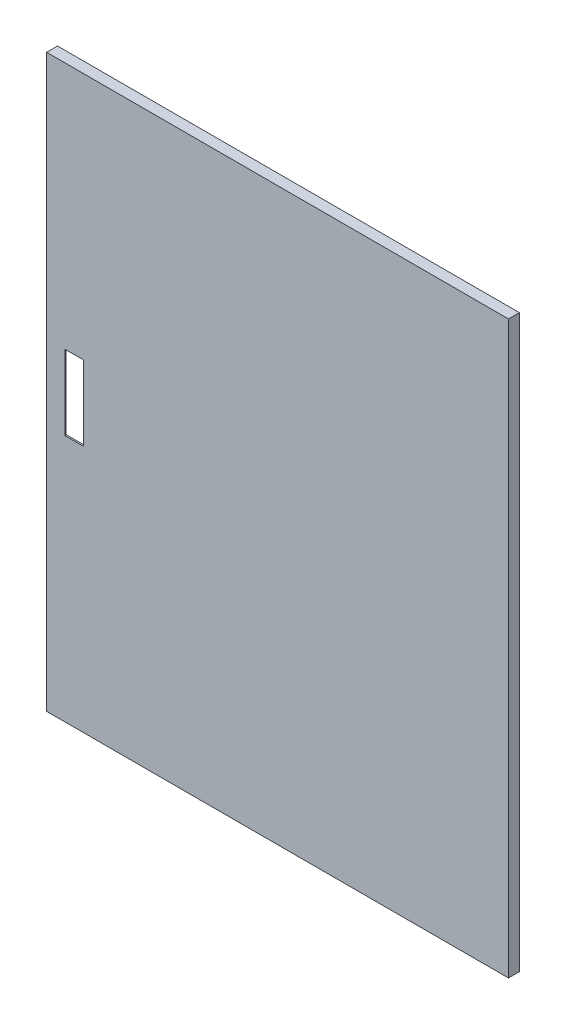
ISO-10303-21;
HEADER;
FILE_DESCRIPTION(('STEP AP214'),'2;1');
FILE_NAME('part.step','',(''),(''),'','','');
FILE_SCHEMA(('AUTOMOTIVE_DESIGN { 1 0 10303 214 1 1 1 1 }'));
ENDSEC;
DATA;
#1=APPLICATION_CONTEXT('core data for automotive mechanical design processes');
#2=APPLICATION_PROTOCOL_DEFINITION('international standard','automotive_design',2000,#1);
#3=PRODUCT_CONTEXT('',#1,'mechanical');
#4=PRODUCT('Part','Part','',(#3));
#5=PRODUCT_RELATED_PRODUCT_CATEGORY('part','',(#4));
#6=PRODUCT_DEFINITION_FORMATION('','',#4);
#7=PRODUCT_DEFINITION_CONTEXT('part definition',#1,'design');
#8=PRODUCT_DEFINITION('design','',#6,#7);
#9=PRODUCT_DEFINITION_SHAPE('','',#8);
#10=(LENGTH_UNIT() NAMED_UNIT(*) SI_UNIT(.MILLI.,.METRE.));
#11=(NAMED_UNIT(*) PLANE_ANGLE_UNIT() SI_UNIT($,.RADIAN.));
#12=(NAMED_UNIT(*) SI_UNIT($,.STERADIAN.) SOLID_ANGLE_UNIT());
#13=UNCERTAINTY_MEASURE_WITH_UNIT(LENGTH_MEASURE(1.E-05),#10,'distance_accuracy_value','');
#14=(GEOMETRIC_REPRESENTATION_CONTEXT(3) GLOBAL_UNCERTAINTY_ASSIGNED_CONTEXT((#13)) GLOBAL_UNIT_ASSIGNED_CONTEXT((#10,
#11,#12)) REPRESENTATION_CONTEXT('',''));
#15=CARTESIAN_POINT('',(0.,0.,0.));
#16=DIRECTION('',(0.,0.,1.));
#17=DIRECTION('',(1.,0.,0.));
#18=AXIS2_PLACEMENT_3D('',#15,#16,#17);
#19=CARTESIAN_POINT('',(-318.,393.,2.));
#20=DIRECTION('',(1.,0.,0.));
#21=DIRECTION('',(0.,1.,0.));
#22=AXIS2_PLACEMENT_3D('',#19,#20,#21);
#23=PLANE('',#22);
#24=DIRECTION('',(0.,0.,-1.));
#25=VECTOR('',#24,1.);
#26=CARTESIAN_POINT('',(-318.,393.,2.));
#27=LINE('',#26,#25);
#28=CARTESIAN_POINT('',(-318.,393.,2.));
#29=VERTEX_POINT('',#28);
#30=CARTESIAN_POINT('',(-318.,393.,-13.));
#31=VERTEX_POINT('',#30);
#32=EDGE_CURVE('E260',#29,#31,#27,.T.);
#33=ORIENTED_EDGE('',*,*,#32,.T.);
#34=DIRECTION('',(0.,1.,0.));
#35=VECTOR('',#34,1.);
#36=CARTESIAN_POINT('',(-318.,-393.,-13.));
#37=LINE('',#36,#35);
#38=CARTESIAN_POINT('',(-318.,-393.,-13.));
#39=VERTEX_POINT('',#38);
#40=EDGE_CURVE('E212',#39,#31,#37,.T.);
#41=ORIENTED_EDGE('',*,*,#40,.F.);
#42=DIRECTION('',(0.,0.,-1.));
#43=VECTOR('',#42,1.);
#44=CARTESIAN_POINT('',(-318.,-393.,2.));
#45=LINE('',#44,#43);
#46=CARTESIAN_POINT('',(-318.,-393.,2.));
#47=VERTEX_POINT('',#46);
#48=EDGE_CURVE('E266',#47,#39,#45,.T.);
#49=ORIENTED_EDGE('',*,*,#48,.F.);
#50=DIRECTION('',(0.,-1.,0.));
#51=VECTOR('',#50,1.);
#52=CARTESIAN_POINT('',(-318.,393.,2.));
#53=LINE('',#52,#51);
#54=EDGE_CURVE('E251',#29,#47,#53,.T.);
#55=ORIENTED_EDGE('',*,*,#54,.F.);
#56=EDGE_LOOP('',(#33,#41,#49,#55));
#57=FACE_BOUND('',#56,.T.);
#58=ADVANCED_FACE('F35',(#57),#23,.F.);
#59=CARTESIAN_POINT('',(-318.,-393.,2.));
#60=DIRECTION('',(0.,1.,0.));
#61=DIRECTION('',(-1.,0.,0.));
#62=AXIS2_PLACEMENT_3D('',#59,#60,#61);
#63=PLANE('',#62);
#64=ORIENTED_EDGE('',*,*,#48,.T.);
#65=DIRECTION('',(-1.,0.,0.));
#66=VECTOR('',#65,1.);
#67=CARTESIAN_POINT('',(318.,-393.,-13.));
#68=LINE('',#67,#66);
#69=CARTESIAN_POINT('',(318.,-393.,-13.));
#70=VERTEX_POINT('',#69);
#71=EDGE_CURVE('E209',#70,#39,#68,.T.);
#72=ORIENTED_EDGE('',*,*,#71,.F.);
#73=DIRECTION('',(0.,0.,-1.));
#74=VECTOR('',#73,1.);
#75=CARTESIAN_POINT('',(318.,-393.,2.));
#76=LINE('',#75,#74);
#77=CARTESIAN_POINT('',(318.,-393.,2.));
#78=VERTEX_POINT('',#77);
#79=EDGE_CURVE('E264',#78,#70,#76,.T.);
#80=ORIENTED_EDGE('',*,*,#79,.F.);
#81=DIRECTION('',(1.,0.,0.));
#82=VECTOR('',#81,1.);
#83=CARTESIAN_POINT('',(-318.,-393.,2.));
#84=LINE('',#83,#82);
#85=EDGE_CURVE('E254',#47,#78,#84,.T.);
#86=ORIENTED_EDGE('',*,*,#85,.F.);
#87=EDGE_LOOP('',(#64,#72,#80,#86));
#88=FACE_BOUND('',#87,.T.);
#89=ADVANCED_FACE('F292',(#88),#63,.F.);
#90=CARTESIAN_POINT('',(318.,393.,2.));
#91=DIRECTION('',(-1.,0.,0.));
#92=DIRECTION('',(0.,0.,1.));
#93=AXIS2_PLACEMENT_3D('',#90,#91,#92);
#94=PLANE('',#93);
#95=ORIENTED_EDGE('',*,*,#79,.T.);
#96=DIRECTION('',(0.,-1.,0.));
#97=VECTOR('',#96,1.);
#98=CARTESIAN_POINT('',(318.,393.,-13.));
#99=LINE('',#98,#97);
#100=CARTESIAN_POINT('',(318.,393.,-13.));
#101=VERTEX_POINT('',#100);
#102=EDGE_CURVE('E206',#101,#70,#99,.T.);
#103=ORIENTED_EDGE('',*,*,#102,.F.);
#104=DIRECTION('',(0.,0.,-1.));
#105=VECTOR('',#104,1.);
#106=CARTESIAN_POINT('',(318.,393.,2.));
#107=LINE('',#106,#105);
#108=CARTESIAN_POINT('',(318.,393.,2.));
#109=VERTEX_POINT('',#108);
#110=EDGE_CURVE('E262',#109,#101,#107,.T.);
#111=ORIENTED_EDGE('',*,*,#110,.F.);
#112=DIRECTION('',(0.,1.,0.));
#113=VECTOR('',#112,1.);
#114=CARTESIAN_POINT('',(318.,393.,2.));
#115=LINE('',#114,#113);
#116=EDGE_CURVE('E256',#78,#109,#115,.T.);
#117=ORIENTED_EDGE('',*,*,#116,.F.);
#118=EDGE_LOOP('',(#95,#103,#111,#117));
#119=FACE_BOUND('',#118,.T.);
#120=ADVANCED_FACE('F297',(#119),#94,.F.);
#121=CARTESIAN_POINT('',(-318.,393.,2.));
#122=DIRECTION('',(0.,-1.,0.));
#123=DIRECTION('',(1.,0.,0.));
#124=AXIS2_PLACEMENT_3D('',#121,#122,#123);
#125=PLANE('',#124);
#126=ORIENTED_EDGE('',*,*,#110,.T.);
#127=DIRECTION('',(1.,0.,0.));
#128=VECTOR('',#127,1.);
#129=CARTESIAN_POINT('',(-318.,393.,-13.));
#130=LINE('',#129,#128);
#131=EDGE_CURVE('E215',#31,#101,#130,.T.);
#132=ORIENTED_EDGE('',*,*,#131,.F.);
#133=ORIENTED_EDGE('',*,*,#32,.F.);
#134=DIRECTION('',(-1.,0.,0.));
#135=VECTOR('',#134,1.);
#136=CARTESIAN_POINT('',(-318.,393.,2.));
#137=LINE('',#136,#135);
#138=EDGE_CURVE('E258',#109,#29,#137,.T.);
#139=ORIENTED_EDGE('',*,*,#138,.F.);
#140=EDGE_LOOP('',(#126,#132,#133,#139));
#141=FACE_BOUND('',#140,.T.);
#142=ADVANCED_FACE('F311',(#141),#125,.F.);
#143=CARTESIAN_POINT('',(0.,0.,2.));
#144=DIRECTION('',(0.,0.,1.));
#145=DIRECTION('',(1.,0.,0.));
#146=AXIS2_PLACEMENT_3D('',#143,#144,#145);
#147=PLANE('',#146);
#148=DIRECTION('',(0.,-1.,0.));
#149=VECTOR('',#148,1.);
#150=CARTESIAN_POINT('',(-293.,51.4999999999999,2.));
#151=LINE('',#150,#149);
#152=CARTESIAN_POINT('',(-293.,51.4999999999999,2.));
#153=VERTEX_POINT('',#152);
#154=CARTESIAN_POINT('',(-293.,-51.5,2.));
#155=VERTEX_POINT('',#154);
#156=EDGE_CURVE('E49',#153,#155,#151,.T.);
#157=ORIENTED_EDGE('',*,*,#156,.F.);
#158=DIRECTION('',(-1.,0.,0.));
#159=VECTOR('',#158,1.);
#160=CARTESIAN_POINT('',(-293.,51.4999999999999,2.));
#161=LINE('',#160,#159);
#162=CARTESIAN_POINT('',(-267.,51.5,2.));
#163=VERTEX_POINT('',#162);
#164=EDGE_CURVE('E166',#163,#153,#161,.T.);
#165=ORIENTED_EDGE('',*,*,#164,.F.);
#166=DIRECTION('',(0.,1.,0.));
#167=VECTOR('',#166,1.);
#168=CARTESIAN_POINT('',(-267.,51.5,2.));
#169=LINE('',#168,#167);
#170=CARTESIAN_POINT('',(-267.,-51.5,2.));
#171=VERTEX_POINT('',#170);
#172=EDGE_CURVE('E150',#171,#163,#169,.T.);
#173=ORIENTED_EDGE('',*,*,#172,.F.);
#174=DIRECTION('',(1.,0.,0.));
#175=VECTOR('',#174,1.);
#176=CARTESIAN_POINT('',(-293.,-51.5,2.));
#177=LINE('',#176,#175);
#178=EDGE_CURVE('E159',#155,#171,#177,.T.);
#179=ORIENTED_EDGE('',*,*,#178,.F.);
#180=EDGE_LOOP('',(#157,#165,#173,#179));
#181=FACE_BOUND('',#180,.T.);
#182=ORIENTED_EDGE('',*,*,#54,.T.);
#183=ORIENTED_EDGE('',*,*,#85,.T.);
#184=ORIENTED_EDGE('',*,*,#116,.T.);
#185=ORIENTED_EDGE('',*,*,#138,.T.);
#186=EDGE_LOOP('',(#182,#183,#184,#185));
#187=FACE_BOUND('',#186,.T.);
#188=ADVANCED_FACE('F163',(#181,#187),#147,.T.);
#189=CARTESIAN_POINT('',(0.,0.,-13.));
#190=DIRECTION('',(0.,0.,-1.));
#191=DIRECTION('',(-1.,0.,0.));
#192=AXIS2_PLACEMENT_3D('',#189,#190,#191);
#193=PLANE('',#192);
#194=ORIENTED_EDGE('',*,*,#102,.T.);
#195=ORIENTED_EDGE('',*,*,#71,.T.);
#196=ORIENTED_EDGE('',*,*,#40,.T.);
#197=ORIENTED_EDGE('',*,*,#131,.T.);
#198=EDGE_LOOP('',(#194,#195,#196,#197));
#199=FACE_BOUND('',#198,.T.);
#200=DIRECTION('',(-1.,0.,0.));
#201=VECTOR('',#200,1.);
#202=CARTESIAN_POINT('',(308.,-383.,-13.));
#203=LINE('',#202,#201);
#204=CARTESIAN_POINT('',(308.,-383.,-13.));
#205=VERTEX_POINT('',#204);
#206=CARTESIAN_POINT('',(-308.,-383.,-13.));
#207=VERTEX_POINT('',#206);
#208=EDGE_CURVE('E178',#205,#207,#203,.T.);
#209=ORIENTED_EDGE('',*,*,#208,.F.);
#210=DIRECTION('',(0.,-1.,0.));
#211=VECTOR('',#210,1.);
#212=CARTESIAN_POINT('',(308.,383.,-13.));
#213=LINE('',#212,#211);
#214=CARTESIAN_POINT('',(308.,383.,-13.));
#215=VERTEX_POINT('',#214);
#216=EDGE_CURVE('E176',#215,#205,#213,.T.);
#217=ORIENTED_EDGE('',*,*,#216,.F.);
#218=DIRECTION('',(1.,0.,0.));
#219=VECTOR('',#218,1.);
#220=CARTESIAN_POINT('',(-308.,383.,-13.));
#221=LINE('',#220,#219);
#222=CARTESIAN_POINT('',(-308.,383.,-13.));
#223=VERTEX_POINT('',#222);
#224=EDGE_CURVE('E184',#223,#215,#221,.T.);
#225=ORIENTED_EDGE('',*,*,#224,.F.);
#226=DIRECTION('',(0.,1.,0.));
#227=VECTOR('',#226,1.);
#228=CARTESIAN_POINT('',(-308.,-383.,-13.));
#229=LINE('',#228,#227);
#230=EDGE_CURVE('E181',#207,#223,#229,.T.);
#231=ORIENTED_EDGE('',*,*,#230,.F.);
#232=EDGE_LOOP('',(#209,#217,#225,#231));
#233=FACE_BOUND('',#232,.T.);
#234=ADVANCED_FACE('F307',(#199,#233),#193,.T.);
#235=CARTESIAN_POINT('',(0.,0.,-11.));
#236=DIRECTION('',(0.,0.,-1.));
#237=DIRECTION('',(-1.,0.,0.));
#238=AXIS2_PLACEMENT_3D('',#235,#236,#237);
#239=PLANE('',#238);
#240=DIRECTION('',(-1.,0.,0.));
#241=VECTOR('',#240,1.);
#242=CARTESIAN_POINT('',(316.,-391.,-11.));
#243=LINE('',#242,#241);
#244=CARTESIAN_POINT('',(316.,-391.,-11.));
#245=VERTEX_POINT('',#244);
#246=CARTESIAN_POINT('',(-316.,-391.,-11.));
#247=VERTEX_POINT('',#246);
#248=EDGE_CURVE('E219',#245,#247,#243,.T.);
#249=ORIENTED_EDGE('',*,*,#248,.F.);
#250=DIRECTION('',(0.,-1.,0.));
#251=VECTOR('',#250,1.);
#252=CARTESIAN_POINT('',(316.,391.,-11.));
#253=LINE('',#252,#251);
#254=CARTESIAN_POINT('',(316.,391.,-11.));
#255=VERTEX_POINT('',#254);
#256=EDGE_CURVE('E229',#255,#245,#253,.T.);
#257=ORIENTED_EDGE('',*,*,#256,.F.);
#258=DIRECTION('',(1.,0.,0.));
#259=VECTOR('',#258,1.);
#260=CARTESIAN_POINT('',(-316.,391.,-11.));
#261=LINE('',#260,#259);
#262=CARTESIAN_POINT('',(-316.,391.,-11.));
#263=VERTEX_POINT('',#262);
#264=EDGE_CURVE('E226',#263,#255,#261,.T.);
#265=ORIENTED_EDGE('',*,*,#264,.F.);
#266=DIRECTION('',(0.,1.,0.));
#267=VECTOR('',#266,1.);
#268=CARTESIAN_POINT('',(-316.,-391.,-11.));
#269=LINE('',#268,#267);
#270=EDGE_CURVE('E222',#247,#263,#269,.T.);
#271=ORIENTED_EDGE('',*,*,#270,.F.);
#272=EDGE_LOOP('',(#249,#257,#265,#271));
#273=FACE_BOUND('',#272,.T.);
#274=DIRECTION('',(0.,-1.,0.));
#275=VECTOR('',#274,1.);
#276=CARTESIAN_POINT('',(308.,383.,-11.));
#277=LINE('',#276,#275);
#278=CARTESIAN_POINT('',(308.,383.,-11.));
#279=VERTEX_POINT('',#278);
#280=CARTESIAN_POINT('',(308.,-383.,-11.));
#281=VERTEX_POINT('',#280);
#282=EDGE_CURVE('E173',#279,#281,#277,.T.);
#283=ORIENTED_EDGE('',*,*,#282,.T.);
#284=DIRECTION('',(-1.,0.,0.));
#285=VECTOR('',#284,1.);
#286=CARTESIAN_POINT('',(308.,-383.,-11.));
#287=LINE('',#286,#285);
#288=CARTESIAN_POINT('',(-308.,-383.,-11.));
#289=VERTEX_POINT('',#288);
#290=EDGE_CURVE('E189',#281,#289,#287,.T.);
#291=ORIENTED_EDGE('',*,*,#290,.T.);
#292=DIRECTION('',(0.,1.,0.));
#293=VECTOR('',#292,1.);
#294=CARTESIAN_POINT('',(-308.,-383.,-11.));
#295=LINE('',#294,#293);
#296=CARTESIAN_POINT('',(-308.,383.,-11.));
#297=VERTEX_POINT('',#296);
#298=EDGE_CURVE('E192',#289,#297,#295,.T.);
#299=ORIENTED_EDGE('',*,*,#298,.T.);
#300=DIRECTION('',(1.,0.,0.));
#301=VECTOR('',#300,1.);
#302=CARTESIAN_POINT('',(-308.,383.,-11.));
#303=LINE('',#302,#301);
#304=EDGE_CURVE('E179',#297,#279,#303,.T.);
#305=ORIENTED_EDGE('',*,*,#304,.T.);
#306=EDGE_LOOP('',(#283,#291,#299,#305));
#307=FACE_BOUND('',#306,.T.);
#308=ADVANCED_FACE('F322',(#273,#307),#239,.F.);
#309=CARTESIAN_POINT('',(308.,383.,-13.));
#310=DIRECTION('',(-1.,0.,0.));
#311=DIRECTION('',(0.,-1.,0.));
#312=AXIS2_PLACEMENT_3D('',#309,#310,#311);
#313=PLANE('',#312);
#314=ORIENTED_EDGE('',*,*,#282,.F.);
#315=DIRECTION('',(0.,0.,1.));
#316=VECTOR('',#315,1.);
#317=CARTESIAN_POINT('',(308.,383.,-13.));
#318=LINE('',#317,#316);
#319=EDGE_CURVE('E186',#215,#279,#318,.T.);
#320=ORIENTED_EDGE('',*,*,#319,.F.);
#321=ORIENTED_EDGE('',*,*,#216,.T.);
#322=DIRECTION('',(0.,0.,1.));
#323=VECTOR('',#322,1.);
#324=CARTESIAN_POINT('',(308.,-383.,-13.));
#325=LINE('',#324,#323);
#326=EDGE_CURVE('E203',#205,#281,#325,.T.);
#327=ORIENTED_EDGE('',*,*,#326,.T.);
#328=EDGE_LOOP('',(#314,#320,#321,#327));
#329=FACE_BOUND('',#328,.T.);
#330=ADVANCED_FACE('F356',(#329),#313,.T.);
#331=CARTESIAN_POINT('',(308.,-383.,-13.));
#332=DIRECTION('',(0.,1.,0.));
#333=DIRECTION('',(-1.,0.,0.));
#334=AXIS2_PLACEMENT_3D('',#331,#332,#333);
#335=PLANE('',#334);
#336=ORIENTED_EDGE('',*,*,#290,.F.);
#337=ORIENTED_EDGE('',*,*,#326,.F.);
#338=ORIENTED_EDGE('',*,*,#208,.T.);
#339=DIRECTION('',(0.,0.,1.));
#340=VECTOR('',#339,1.);
#341=CARTESIAN_POINT('',(-308.,-383.,-13.));
#342=LINE('',#341,#340);
#343=EDGE_CURVE('E201',#207,#289,#342,.T.);
#344=ORIENTED_EDGE('',*,*,#343,.T.);
#345=EDGE_LOOP('',(#336,#337,#338,#344));
#346=FACE_BOUND('',#345,.T.);
#347=ADVANCED_FACE('F366',(#346),#335,.T.);
#348=CARTESIAN_POINT('',(-308.,-383.,-13.));
#349=DIRECTION('',(1.,0.,0.));
#350=DIRECTION('',(0.,0.,-1.));
#351=AXIS2_PLACEMENT_3D('',#348,#349,#350);
#352=PLANE('',#351);
#353=ORIENTED_EDGE('',*,*,#298,.F.);
#354=ORIENTED_EDGE('',*,*,#343,.F.);
#355=ORIENTED_EDGE('',*,*,#230,.T.);
#356=DIRECTION('',(0.,0.,1.));
#357=VECTOR('',#356,1.);
#358=CARTESIAN_POINT('',(-308.,383.,-13.));
#359=LINE('',#358,#357);
#360=EDGE_CURVE('E199',#223,#297,#359,.T.);
#361=ORIENTED_EDGE('',*,*,#360,.T.);
#362=EDGE_LOOP('',(#353,#354,#355,#361));
#363=FACE_BOUND('',#362,.T.);
#364=ADVANCED_FACE('F376',(#363),#352,.T.);
#365=CARTESIAN_POINT('',(-308.,383.,-13.));
#366=DIRECTION('',(0.,-1.,0.));
#367=DIRECTION('',(1.,0.,0.));
#368=AXIS2_PLACEMENT_3D('',#365,#366,#367);
#369=PLANE('',#368);
#370=ORIENTED_EDGE('',*,*,#304,.F.);
#371=ORIENTED_EDGE('',*,*,#360,.F.);
#372=ORIENTED_EDGE('',*,*,#224,.T.);
#373=ORIENTED_EDGE('',*,*,#319,.T.);
#374=EDGE_LOOP('',(#370,#371,#372,#373));
#375=FACE_BOUND('',#374,.T.);
#376=ADVANCED_FACE('F329',(#375),#369,.T.);
#377=CARTESIAN_POINT('',(0.,0.,0.));
#378=DIRECTION('',(0.,0.,1.));
#379=DIRECTION('',(1.,0.,0.));
#380=AXIS2_PLACEMENT_3D('',#377,#378,#379);
#381=PLANE('',#380);
#382=DIRECTION('',(-1.,0.,0.));
#383=VECTOR('',#382,1.);
#384=CARTESIAN_POINT('',(-3.2986434097037E-13,51.5000000000018,0.));
#385=LINE('',#384,#383);
#386=CARTESIAN_POINT('',(-267.,51.5,0.));
#387=VERTEX_POINT('',#386);
#388=CARTESIAN_POINT('',(-293.,51.4999999999999,0.));
#389=VERTEX_POINT('',#388);
#390=EDGE_CURVE('E42',#387,#389,#385,.T.);
#391=ORIENTED_EDGE('',*,*,#390,.T.);
#392=DIRECTION('',(0.,-1.,0.));
#393=VECTOR('',#392,1.);
#394=CARTESIAN_POINT('',(-293.,0.,0.));
#395=LINE('',#394,#393);
#396=CARTESIAN_POINT('',(-293.,-51.5,0.));
#397=VERTEX_POINT('',#396);
#398=EDGE_CURVE('E11',#389,#397,#395,.T.);
#399=ORIENTED_EDGE('',*,*,#398,.T.);
#400=DIRECTION('',(1.,0.,0.));
#401=VECTOR('',#400,1.);
#402=CARTESIAN_POINT('',(0.,-51.5,0.));
#403=LINE('',#402,#401);
#404=CARTESIAN_POINT('',(-267.,-51.5,0.));
#405=VERTEX_POINT('',#404);
#406=EDGE_CURVE('E268',#397,#405,#403,.T.);
#407=ORIENTED_EDGE('',*,*,#406,.T.);
#408=DIRECTION('',(0.,1.,0.));
#409=VECTOR('',#408,1.);
#410=CARTESIAN_POINT('',(-267.,0.,0.));
#411=LINE('',#410,#409);
#412=EDGE_CURVE('E153',#405,#387,#411,.T.);
#413=ORIENTED_EDGE('',*,*,#412,.T.);
#414=EDGE_LOOP('',(#391,#399,#407,#413));
#415=FACE_BOUND('',#414,.T.);
#416=DIRECTION('',(0.,-1.,0.));
#417=VECTOR('',#416,1.);
#418=CARTESIAN_POINT('',(316.,391.,0.));
#419=LINE('',#418,#417);
#420=CARTESIAN_POINT('',(316.,391.,0.));
#421=VERTEX_POINT('',#420);
#422=CARTESIAN_POINT('',(316.,-391.,0.));
#423=VERTEX_POINT('',#422);
#424=EDGE_CURVE('E223',#421,#423,#419,.T.);
#425=ORIENTED_EDGE('',*,*,#424,.T.);
#426=DIRECTION('',(-1.,0.,0.));
#427=VECTOR('',#426,1.);
#428=CARTESIAN_POINT('',(316.,-391.,0.));
#429=LINE('',#428,#427);
#430=CARTESIAN_POINT('',(-316.,-391.,0.));
#431=VERTEX_POINT('',#430);
#432=EDGE_CURVE('E218',#423,#431,#429,.T.);
#433=ORIENTED_EDGE('',*,*,#432,.T.);
#434=DIRECTION('',(0.,1.,0.));
#435=VECTOR('',#434,1.);
#436=CARTESIAN_POINT('',(-316.,-391.,0.));
#437=LINE('',#436,#435);
#438=CARTESIAN_POINT('',(-316.,391.,0.));
#439=VERTEX_POINT('',#438);
#440=EDGE_CURVE('E235',#431,#439,#437,.T.);
#441=ORIENTED_EDGE('',*,*,#440,.T.);
#442=DIRECTION('',(1.,0.,0.));
#443=VECTOR('',#442,1.);
#444=CARTESIAN_POINT('',(-316.,391.,0.));
#445=LINE('',#444,#443);
#446=EDGE_CURVE('E238',#439,#421,#445,.T.);
#447=ORIENTED_EDGE('',*,*,#446,.T.);
#448=EDGE_LOOP('',(#425,#433,#441,#447));
#449=FACE_BOUND('',#448,.T.);
#450=ADVANCED_FACE('F272',(#415,#449),#381,.F.);
#451=CARTESIAN_POINT('',(316.,391.,-11.));
#452=DIRECTION('',(-1.,0.,0.));
#453=DIRECTION('',(0.,-1.,0.));
#454=AXIS2_PLACEMENT_3D('',#451,#452,#453);
#455=PLANE('',#454);
#456=ORIENTED_EDGE('',*,*,#424,.F.);
#457=DIRECTION('',(0.,0.,1.));
#458=VECTOR('',#457,1.);
#459=CARTESIAN_POINT('',(316.,391.,-11.));
#460=LINE('',#459,#458);
#461=EDGE_CURVE('E244',#255,#421,#460,.T.);
#462=ORIENTED_EDGE('',*,*,#461,.F.);
#463=ORIENTED_EDGE('',*,*,#256,.T.);
#464=DIRECTION('',(0.,0.,1.));
#465=VECTOR('',#464,1.);
#466=CARTESIAN_POINT('',(316.,-391.,-11.));
#467=LINE('',#466,#465);
#468=EDGE_CURVE('E232',#245,#423,#467,.T.);
#469=ORIENTED_EDGE('',*,*,#468,.T.);
#470=EDGE_LOOP('',(#456,#462,#463,#469));
#471=FACE_BOUND('',#470,.T.);
#472=ADVANCED_FACE('F328',(#471),#455,.T.);
#473=CARTESIAN_POINT('',(-316.,391.,-11.));
#474=DIRECTION('',(0.,-1.,0.));
#475=DIRECTION('',(1.,0.,0.));
#476=AXIS2_PLACEMENT_3D('',#473,#474,#475);
#477=PLANE('',#476);
#478=ORIENTED_EDGE('',*,*,#446,.F.);
#479=DIRECTION('',(0.,0.,1.));
#480=VECTOR('',#479,1.);
#481=CARTESIAN_POINT('',(-316.,391.,-11.));
#482=LINE('',#481,#480);
#483=EDGE_CURVE('E246',#263,#439,#482,.T.);
#484=ORIENTED_EDGE('',*,*,#483,.F.);
#485=ORIENTED_EDGE('',*,*,#264,.T.);
#486=ORIENTED_EDGE('',*,*,#461,.T.);
#487=EDGE_LOOP('',(#478,#484,#485,#486));
#488=FACE_BOUND('',#487,.T.);
#489=ADVANCED_FACE('F404',(#488),#477,.T.);
#490=CARTESIAN_POINT('',(-316.,-391.,-11.));
#491=DIRECTION('',(1.,0.,0.));
#492=DIRECTION('',(0.,0.,-1.));
#493=AXIS2_PLACEMENT_3D('',#490,#491,#492);
#494=PLANE('',#493);
#495=ORIENTED_EDGE('',*,*,#440,.F.);
#496=DIRECTION('',(0.,0.,1.));
#497=VECTOR('',#496,1.);
#498=CARTESIAN_POINT('',(-316.,-391.,-11.));
#499=LINE('',#498,#497);
#500=EDGE_CURVE('E248',#247,#431,#499,.T.);
#501=ORIENTED_EDGE('',*,*,#500,.F.);
#502=ORIENTED_EDGE('',*,*,#270,.T.);
#503=ORIENTED_EDGE('',*,*,#483,.T.);
#504=EDGE_LOOP('',(#495,#501,#502,#503));
#505=FACE_BOUND('',#504,.T.);
#506=ADVANCED_FACE('F286',(#505),#494,.T.);
#507=CARTESIAN_POINT('',(316.,-391.,-11.));
#508=DIRECTION('',(0.,1.,0.));
#509=DIRECTION('',(-1.,0.,0.));
#510=AXIS2_PLACEMENT_3D('',#507,#508,#509);
#511=PLANE('',#510);
#512=ORIENTED_EDGE('',*,*,#432,.F.);
#513=ORIENTED_EDGE('',*,*,#468,.F.);
#514=ORIENTED_EDGE('',*,*,#248,.T.);
#515=ORIENTED_EDGE('',*,*,#500,.T.);
#516=EDGE_LOOP('',(#512,#513,#514,#515));
#517=FACE_BOUND('',#516,.T.);
#518=ADVANCED_FACE('F279',(#517),#511,.T.);
#519=CARTESIAN_POINT('',(-293.,51.4999999999999,-8.));
#520=DIRECTION('',(-1.,0.,0.));
#521=DIRECTION('',(0.,0.,1.));
#522=AXIS2_PLACEMENT_3D('',#519,#520,#521);
#523=PLANE('',#522);
#524=DIRECTION('',(0.,0.,1.));
#525=VECTOR('',#524,1.);
#526=CARTESIAN_POINT('',(-293.,51.4999999999999,-8.));
#527=LINE('',#526,#525);
#528=EDGE_CURVE('E171',#389,#153,#527,.T.);
#529=ORIENTED_EDGE('',*,*,#528,.T.);
#530=ORIENTED_EDGE('',*,*,#156,.T.);
#531=DIRECTION('',(0.,0.,1.));
#532=VECTOR('',#531,1.);
#533=CARTESIAN_POINT('',(-293.,-51.5,-8.));
#534=LINE('',#533,#532);
#535=EDGE_CURVE('E156',#397,#155,#534,.T.);
#536=ORIENTED_EDGE('',*,*,#535,.F.);
#537=ORIENTED_EDGE('',*,*,#398,.F.);
#538=EDGE_LOOP('',(#529,#530,#536,#537));
#539=FACE_BOUND('',#538,.T.);
#540=ADVANCED_FACE('F277',(#539),#523,.F.);
#541=CARTESIAN_POINT('',(-293.,51.4999999999999,-8.));
#542=DIRECTION('',(0.,1.,0.));
#543=DIRECTION('',(-1.,0.,0.));
#544=AXIS2_PLACEMENT_3D('',#541,#542,#543);
#545=PLANE('',#544);
#546=DIRECTION('',(0.,0.,1.));
#547=VECTOR('',#546,1.);
#548=CARTESIAN_POINT('',(-267.,51.5,-8.));
#549=LINE('',#548,#547);
#550=EDGE_CURVE('E155',#387,#163,#549,.T.);
#551=ORIENTED_EDGE('',*,*,#550,.T.);
#552=ORIENTED_EDGE('',*,*,#164,.T.);
#553=ORIENTED_EDGE('',*,*,#528,.F.);
#554=ORIENTED_EDGE('',*,*,#390,.F.);
#555=EDGE_LOOP('',(#551,#552,#553,#554));
#556=FACE_BOUND('',#555,.T.);
#557=ADVANCED_FACE('F276',(#556),#545,.F.);
#558=CARTESIAN_POINT('',(-267.,51.5,-8.));
#559=DIRECTION('',(1.,0.,0.));
#560=DIRECTION('',(0.,0.,-1.));
#561=AXIS2_PLACEMENT_3D('',#558,#559,#560);
#562=PLANE('',#561);
#563=DIRECTION('',(0.,0.,1.));
#564=VECTOR('',#563,1.);
#565=CARTESIAN_POINT('',(-267.,-51.5,-8.));
#566=LINE('',#565,#564);
#567=EDGE_CURVE('E57',#405,#171,#566,.T.);
#568=ORIENTED_EDGE('',*,*,#567,.T.);
#569=ORIENTED_EDGE('',*,*,#172,.T.);
#570=ORIENTED_EDGE('',*,*,#550,.F.);
#571=ORIENTED_EDGE('',*,*,#412,.F.);
#572=EDGE_LOOP('',(#568,#569,#570,#571));
#573=FACE_BOUND('',#572,.T.);
#574=ADVANCED_FACE('F147',(#573),#562,.F.);
#575=CARTESIAN_POINT('',(-293.,-51.5,-8.));
#576=DIRECTION('',(0.,-1.,0.));
#577=DIRECTION('',(0.,0.,-1.));
#578=AXIS2_PLACEMENT_3D('',#575,#576,#577);
#579=PLANE('',#578);
#580=ORIENTED_EDGE('',*,*,#535,.T.);
#581=ORIENTED_EDGE('',*,*,#178,.T.);
#582=ORIENTED_EDGE('',*,*,#567,.F.);
#583=ORIENTED_EDGE('',*,*,#406,.F.);
#584=EDGE_LOOP('',(#580,#581,#582,#583));
#585=FACE_BOUND('',#584,.T.);
#586=ADVANCED_FACE('F160',(#585),#579,.F.);
#587=CLOSED_SHELL('',(#58,#89,#120,#142,#188,#234,#308,#330,#347,#364,#376,#450,#472,#489,#506,
#518,#540,#557,#574,#586));
#588=MANIFOLD_SOLID_BREP('B2',#587);
#589=ADVANCED_BREP_SHAPE_REPRESENTATION('',(#18,#588),#14);
#590=SHAPE_DEFINITION_REPRESENTATION(#9,#589);
ENDSEC;
END-ISO-10303-21;
